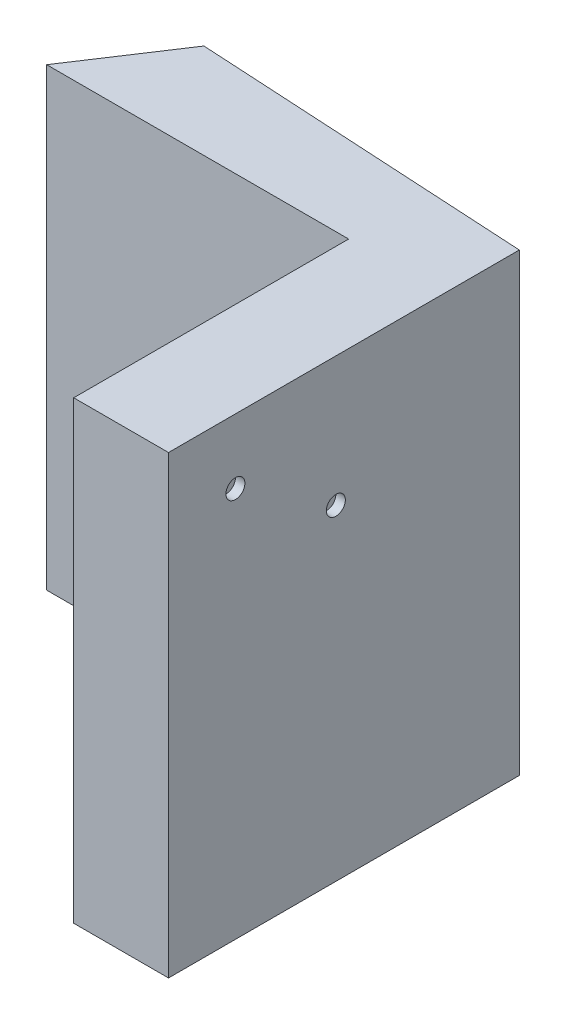
ISO-10303-21;
HEADER;
FILE_DESCRIPTION(('STEP AP214'),'2;1');
FILE_NAME('part.step','',(''),(''),'','','');
FILE_SCHEMA(('AUTOMOTIVE_DESIGN { 1 0 10303 214 1 1 1 1 }'));
ENDSEC;
DATA;
#1=APPLICATION_CONTEXT('core data for automotive mechanical design processes');
#2=APPLICATION_PROTOCOL_DEFINITION('international standard','automotive_design',2000,#1);
#3=PRODUCT_CONTEXT('',#1,'mechanical');
#4=PRODUCT('Part','Part','',(#3));
#5=PRODUCT_RELATED_PRODUCT_CATEGORY('part','',(#4));
#6=PRODUCT_DEFINITION_FORMATION('','',#4);
#7=PRODUCT_DEFINITION_CONTEXT('part definition',#1,'design');
#8=PRODUCT_DEFINITION('design','',#6,#7);
#9=PRODUCT_DEFINITION_SHAPE('','',#8);
#10=(LENGTH_UNIT() NAMED_UNIT(*) SI_UNIT(.MILLI.,.METRE.));
#11=(NAMED_UNIT(*) PLANE_ANGLE_UNIT() SI_UNIT($,.RADIAN.));
#12=(NAMED_UNIT(*) SI_UNIT($,.STERADIAN.) SOLID_ANGLE_UNIT());
#13=UNCERTAINTY_MEASURE_WITH_UNIT(LENGTH_MEASURE(1.E-05),#10,'distance_accuracy_value','');
#14=(GEOMETRIC_REPRESENTATION_CONTEXT(3) GLOBAL_UNCERTAINTY_ASSIGNED_CONTEXT((#13)) GLOBAL_UNIT_ASSIGNED_CONTEXT((#10,
#11,#12)) REPRESENTATION_CONTEXT('',''));
#15=CARTESIAN_POINT('',(0.,0.,0.));
#16=DIRECTION('',(0.,0.,1.));
#17=DIRECTION('',(1.,0.,0.));
#18=AXIS2_PLACEMENT_3D('',#15,#16,#17);
#19=CARTESIAN_POINT('',(0.,48.,0.));
#20=DIRECTION('',(0.,0.,1.));
#21=DIRECTION('',(1.,0.,0.));
#22=AXIS2_PLACEMENT_3D('',#19,#20,#21);
#23=PLANE('',#22);
#24=DIRECTION('',(-1.,0.,0.));
#25=VECTOR('',#24,1.);
#26=CARTESIAN_POINT('',(0.,17.96,0.));
#27=LINE('',#26,#25);
#28=CARTESIAN_POINT('',(0.,17.96,0.));
#29=VERTEX_POINT('',#28);
#30=CARTESIAN_POINT('',(-31.85,17.96,0.));
#31=VERTEX_POINT('',#30);
#32=EDGE_CURVE('E93',#29,#31,#27,.T.);
#33=ORIENTED_EDGE('',*,*,#32,.F.);
#34=DIRECTION('',(0.,-1.,0.));
#35=VECTOR('',#34,1.);
#36=CARTESIAN_POINT('',(0.,48.,0.));
#37=LINE('',#36,#35);
#38=CARTESIAN_POINT('',(0.,65.96,0.));
#39=VERTEX_POINT('',#38);
#40=EDGE_CURVE('E167',#39,#29,#37,.T.);
#41=ORIENTED_EDGE('',*,*,#40,.F.);
#42=DIRECTION('',(1.,0.,0.));
#43=VECTOR('',#42,1.);
#44=CARTESIAN_POINT('',(0.,65.96,0.));
#45=LINE('',#44,#43);
#46=CARTESIAN_POINT('',(-31.85,65.96,0.));
#47=VERTEX_POINT('',#46);
#48=EDGE_CURVE('E121',#47,#39,#45,.T.);
#49=ORIENTED_EDGE('',*,*,#48,.F.);
#50=DIRECTION('',(0.,-1.,0.));
#51=VECTOR('',#50,1.);
#52=CARTESIAN_POINT('',(-31.85,48.,0.));
#53=LINE('',#52,#51);
#54=EDGE_CURVE('E40',#47,#31,#53,.T.);
#55=ORIENTED_EDGE('',*,*,#54,.T.);
#56=EDGE_LOOP('',(#33,#41,#49,#55));
#57=FACE_BOUND('',#56,.T.);
#58=CARTESIAN_POINT('',(-5.62968108342815,24.9790510727815,0.));
#59=DIRECTION('',(0.,0.,1.));
#60=DIRECTION('',(1.,0.,0.));
#61=AXIS2_PLACEMENT_3D('',#58,#59,#60);
#62=CIRCLE('',#61,2.);
#63=CARTESIAN_POINT('',(-3.62968108342815,24.9790510727815,0.));
#64=VERTEX_POINT('',#63);
#65=EDGE_CURVE('E153',#64,#64,#62,.T.);
#66=ORIENTED_EDGE('',*,*,#65,.F.);
#67=EDGE_LOOP('',(#66));
#68=FACE_BOUND('',#67,.T.);
#69=CARTESIAN_POINT('',(-21.5913355474178,41.0209489272188,0.));
#70=DIRECTION('',(0.,0.,1.));
#71=DIRECTION('',(1.,0.,0.));
#72=AXIS2_PLACEMENT_3D('',#69,#70,#71);
#73=CIRCLE('',#72,2.);
#74=CARTESIAN_POINT('',(-19.5913355474178,41.0209489272188,0.));
#75=VERTEX_POINT('',#74);
#76=EDGE_CURVE('E150',#75,#75,#73,.T.);
#77=ORIENTED_EDGE('',*,*,#76,.F.);
#78=EDGE_LOOP('',(#77));
#79=FACE_BOUND('',#78,.T.);
#80=CARTESIAN_POINT('',(-21.6314572426416,25.0191727680053,0.));
#81=DIRECTION('',(0.,0.,1.));
#82=DIRECTION('',(1.,0.,0.));
#83=AXIS2_PLACEMENT_3D('',#80,#81,#82);
#84=CIRCLE('',#83,2.);
#85=CARTESIAN_POINT('',(-19.6314572426416,25.0191727680053,0.));
#86=VERTEX_POINT('',#85);
#87=EDGE_CURVE('E147',#86,#86,#84,.T.);
#88=ORIENTED_EDGE('',*,*,#87,.F.);
#89=EDGE_LOOP('',(#88));
#90=FACE_BOUND('',#89,.T.);
#91=CARTESIAN_POINT('',(-13.6296810834282,32.9790510727815,0.));
#92=DIRECTION('',(0.,0.,1.));
#93=DIRECTION('',(1.,0.,0.));
#94=AXIS2_PLACEMENT_3D('',#91,#92,#93);
#95=CIRCLE('',#94,4.2);
#96=CARTESIAN_POINT('',(-9.42968108342816,32.9790510727815,0.));
#97=VERTEX_POINT('',#96);
#98=EDGE_CURVE('E146',#97,#97,#95,.T.);
#99=ORIENTED_EDGE('',*,*,#98,.F.);
#100=EDGE_LOOP('',(#99));
#101=FACE_BOUND('',#100,.T.);
#102=CARTESIAN_POINT('',(-5.58955938820431,40.9808272319949,0.));
#103=DIRECTION('',(0.,0.,1.));
#104=DIRECTION('',(1.,0.,0.));
#105=AXIS2_PLACEMENT_3D('',#102,#103,#104);
#106=CIRCLE('',#105,2.00000000000001);
#107=CARTESIAN_POINT('',(-3.5895593882043,40.9808272319949,0.));
#108=VERTEX_POINT('',#107);
#109=EDGE_CURVE('E156',#108,#108,#106,.T.);
#110=ORIENTED_EDGE('',*,*,#109,.F.);
#111=EDGE_LOOP('',(#110));
#112=FACE_BOUND('',#111,.T.);
#113=ADVANCED_FACE('F33',(#57,#68,#79,#90,#101,#112),#23,.T.);
#114=CARTESIAN_POINT('',(0.,48.,0.));
#115=DIRECTION('',(1.,0.,0.));
#116=DIRECTION('',(0.,0.,-1.));
#117=AXIS2_PLACEMENT_3D('',#114,#115,#116);
#118=PLANE('',#117);
#119=ORIENTED_EDGE('',*,*,#40,.T.);
#120=DIRECTION('',(0.,0.,1.));
#121=VECTOR('',#120,1.);
#122=CARTESIAN_POINT('',(0.,17.96,0.));
#123=LINE('',#122,#121);
#124=CARTESIAN_POINT('',(0.,17.96,29.));
#125=VERTEX_POINT('',#124);
#126=EDGE_CURVE('E52',#29,#125,#123,.T.);
#127=ORIENTED_EDGE('',*,*,#126,.T.);
#128=DIRECTION('',(0.,-1.,0.));
#129=VECTOR('',#128,1.);
#130=CARTESIAN_POINT('',(0.,48.,29.));
#131=LINE('',#130,#129);
#132=CARTESIAN_POINT('',(0.,65.96,29.));
#133=VERTEX_POINT('',#132);
#134=EDGE_CURVE('E164',#133,#125,#131,.T.);
#135=ORIENTED_EDGE('',*,*,#134,.F.);
#136=DIRECTION('',(0.,0.,1.));
#137=VECTOR('',#136,1.);
#138=CARTESIAN_POINT('',(0.,65.96,29.));
#139=LINE('',#138,#137);
#140=EDGE_CURVE('E124',#39,#133,#139,.T.);
#141=ORIENTED_EDGE('',*,*,#140,.F.);
#142=EDGE_LOOP('',(#119,#127,#135,#141));
#143=FACE_BOUND('',#142,.T.);
#144=ADVANCED_FACE('F194',(#143),#118,.F.);
#145=CARTESIAN_POINT('',(0.,48.,29.));
#146=DIRECTION('',(0.,0.,-1.));
#147=DIRECTION('',(-1.,0.,0.));
#148=AXIS2_PLACEMENT_3D('',#145,#146,#147);
#149=PLANE('',#148);
#150=ORIENTED_EDGE('',*,*,#134,.T.);
#151=DIRECTION('',(1.,0.,0.));
#152=VECTOR('',#151,1.);
#153=CARTESIAN_POINT('',(0.,17.96,29.));
#154=LINE('',#153,#152);
#155=CARTESIAN_POINT('',(10.,17.96,29.));
#156=VERTEX_POINT('',#155);
#157=EDGE_CURVE('E129',#125,#156,#154,.T.);
#158=ORIENTED_EDGE('',*,*,#157,.T.);
#159=DIRECTION('',(0.,-1.,0.));
#160=VECTOR('',#159,1.);
#161=CARTESIAN_POINT('',(10.,48.,29.));
#162=LINE('',#161,#160);
#163=CARTESIAN_POINT('',(10.,65.96,29.));
#164=VERTEX_POINT('',#163);
#165=EDGE_CURVE('E162',#164,#156,#162,.T.);
#166=ORIENTED_EDGE('',*,*,#165,.F.);
#167=DIRECTION('',(1.,0.,0.));
#168=VECTOR('',#167,1.);
#169=CARTESIAN_POINT('',(10.,65.96,29.));
#170=LINE('',#169,#168);
#171=EDGE_CURVE('E110',#133,#164,#170,.T.);
#172=ORIENTED_EDGE('',*,*,#171,.F.);
#173=EDGE_LOOP('',(#150,#158,#166,#172));
#174=FACE_BOUND('',#173,.T.);
#175=ADVANCED_FACE('F200',(#174),#149,.F.);
#176=CARTESIAN_POINT('',(10.,48.,0.));
#177=DIRECTION('',(-1.,0.,0.));
#178=DIRECTION('',(0.,0.,1.));
#179=AXIS2_PLACEMENT_3D('',#176,#177,#178);
#180=PLANE('',#179);
#181=CARTESIAN_POINT('',(10.,59.1327980092586,21.9428792738086));
#182=DIRECTION('',(1.,0.,0.));
#183=DIRECTION('',(0.,0.,-1.));
#184=AXIS2_PLACEMENT_3D('',#181,#182,#183);
#185=CIRCLE('',#184,1.);
#186=CARTESIAN_POINT('',(10.,59.1327980092586,20.9428792738086));
#187=VERTEX_POINT('',#186);
#188=EDGE_CURVE('E114',#187,#187,#185,.T.);
#189=ORIENTED_EDGE('',*,*,#188,.F.);
#190=EDGE_LOOP('',(#189));
#191=FACE_BOUND('',#190,.T.);
#192=CARTESIAN_POINT('',(10.,52.3121828554309,11.3475695049487));
#193=DIRECTION('',(1.,0.,0.));
#194=DIRECTION('',(0.,0.,-1.));
#195=AXIS2_PLACEMENT_3D('',#192,#193,#194);
#196=CIRCLE('',#195,1.);
#197=CARTESIAN_POINT('',(10.,52.3121828554309,10.3475695049487));
#198=VERTEX_POINT('',#197);
#199=EDGE_CURVE('E117',#198,#198,#196,.T.);
#200=ORIENTED_EDGE('',*,*,#199,.F.);
#201=EDGE_LOOP('',(#200));
#202=FACE_BOUND('',#201,.T.);
#203=ORIENTED_EDGE('',*,*,#165,.T.);
#204=DIRECTION('',(0.,0.,-1.));
#205=VECTOR('',#204,1.);
#206=CARTESIAN_POINT('',(10.,17.96,0.));
#207=LINE('',#206,#205);
#208=CARTESIAN_POINT('',(10.,17.96,-8.));
#209=VERTEX_POINT('',#208);
#210=EDGE_CURVE('E90',#156,#209,#207,.T.);
#211=ORIENTED_EDGE('',*,*,#210,.T.);
#212=DIRECTION('',(0.,1.,0.));
#213=VECTOR('',#212,1.);
#214=CARTESIAN_POINT('',(10.,0.,-8.));
#215=LINE('',#214,#213);
#216=CARTESIAN_POINT('',(10.,65.96,-8.));
#217=VERTEX_POINT('',#216);
#218=EDGE_CURVE('E84',#209,#217,#215,.T.);
#219=ORIENTED_EDGE('',*,*,#218,.T.);
#220=DIRECTION('',(0.,0.,-1.));
#221=VECTOR('',#220,1.);
#222=CARTESIAN_POINT('',(10.,65.96,-8.));
#223=LINE('',#222,#221);
#224=EDGE_CURVE('E89',#164,#217,#223,.T.);
#225=ORIENTED_EDGE('',*,*,#224,.F.);
#226=EDGE_LOOP('',(#203,#211,#219,#225));
#227=FACE_BOUND('',#226,.T.);
#228=ADVANCED_FACE('F87',(#191,#202,#227),#180,.F.);
#229=CARTESIAN_POINT('',(-25.2631742495093,0.,-10.));
#230=DIRECTION('',(0.835114859081226,0.,0.550075605841365));
#231=DIRECTION('',(0.550075605841365,0.,-0.835114859081226));
#232=AXIS2_PLACEMENT_3D('',#229,#230,#231);
#233=PLANE('',#232);
#234=DIRECTION('',(0.,1.,0.));
#235=VECTOR('',#234,1.);
#236=CARTESIAN_POINT('',(-25.2631742495093,0.,-10.));
#237=LINE('',#236,#235);
#238=CARTESIAN_POINT('',(-25.2631742495093,17.96,-10.));
#239=VERTEX_POINT('',#238);
#240=CARTESIAN_POINT('',(-25.2631742495093,65.96,-10.));
#241=VERTEX_POINT('',#240);
#242=EDGE_CURVE('E100',#239,#241,#237,.T.);
#243=ORIENTED_EDGE('',*,*,#242,.F.);
#244=DIRECTION('',(-0.550075605841365,0.,0.835114859081226));
#245=VECTOR('',#244,1.);
#246=CARTESIAN_POINT('',(-25.2631742495093,17.96,-10.));
#247=LINE('',#246,#245);
#248=EDGE_CURVE('E47',#239,#31,#247,.T.);
#249=ORIENTED_EDGE('',*,*,#248,.T.);
#250=ORIENTED_EDGE('',*,*,#54,.F.);
#251=DIRECTION('',(-0.550075605841365,0.,0.835114859081226));
#252=VECTOR('',#251,1.);
#253=CARTESIAN_POINT('',(-31.85,65.96,0.));
#254=LINE('',#253,#252);
#255=EDGE_CURVE('E104',#241,#47,#254,.T.);
#256=ORIENTED_EDGE('',*,*,#255,.F.);
#257=EDGE_LOOP('',(#243,#249,#250,#256));
#258=FACE_BOUND('',#257,.T.);
#259=ADVANCED_FACE('F189',(#258),#233,.F.);
#260=CARTESIAN_POINT('',(-5.58955938820431,40.9808272319949,-48.));
#261=DIRECTION('',(0.,0.,1.));
#262=DIRECTION('',(1.,0.,0.));
#263=AXIS2_PLACEMENT_3D('',#260,#261,#262);
#264=CYLINDRICAL_SURFACE('',#263,2.00000000000001);
#265=CARTESIAN_POINT('',(-5.58955938820431,40.9808272319949,-8.88418355522384));
#266=DIRECTION('',(-0.0566253898941637,0.,0.998395495392149));
#267=DIRECTION('',(0.998395495392149,0.,0.0566253898941637));
#268=AXIS2_PLACEMENT_3D('',#265,#266,#267);
#269=ELLIPSE('',#268,2.00321416636045,2.00000000000001);
#270=CARTESIAN_POINT('',(-3.5895593882043,40.9808272319949,-8.77075077201216));
#271=VERTEX_POINT('',#270);
#272=EDGE_CURVE('E143',#271,#271,#269,.F.);
#273=ORIENTED_EDGE('',*,*,#272,.T.);
#274=EDGE_LOOP('',(#273));
#275=FACE_BOUND('',#274,.T.);
#276=ORIENTED_EDGE('',*,*,#109,.T.);
#277=EDGE_LOOP('',(#276));
#278=FACE_BOUND('',#277,.T.);
#279=ADVANCED_FACE('F185',(#275,#278),#264,.F.);
#280=CARTESIAN_POINT('',(-13.6296810834282,32.9790510727815,-48.));
#281=DIRECTION('',(0.,0.,1.));
#282=DIRECTION('',(1.,0.,0.));
#283=AXIS2_PLACEMENT_3D('',#280,#281,#282);
#284=CYLINDRICAL_SURFACE('',#283,4.2);
#285=CARTESIAN_POINT('',(-13.6296810834282,32.9790510727815,-9.34019024584873));
#286=DIRECTION('',(-0.0566253898941637,0.,0.998395495392149));
#287=DIRECTION('',(0.998395495392149,0.,0.0566253898941637));
#288=AXIS2_PLACEMENT_3D('',#285,#286,#287);
#289=ELLIPSE('',#288,4.20674974935692,4.2);
#290=CARTESIAN_POINT('',(-9.42968108342816,32.9790510727815,-9.10198140110422));
#291=VERTEX_POINT('',#290);
#292=EDGE_CURVE('E140',#291,#291,#289,.F.);
#293=ORIENTED_EDGE('',*,*,#292,.T.);
#294=EDGE_LOOP('',(#293));
#295=FACE_BOUND('',#294,.T.);
#296=ORIENTED_EDGE('',*,*,#98,.T.);
#297=EDGE_LOOP('',(#296));
#298=FACE_BOUND('',#297,.T.);
#299=ADVANCED_FACE('F188',(#295,#298),#284,.F.);
#300=CARTESIAN_POINT('',(-21.6314572426416,25.0191727680053,-48.));
#301=DIRECTION('',(0.,0.,1.));
#302=DIRECTION('',(1.,0.,0.));
#303=AXIS2_PLACEMENT_3D('',#300,#301,#302);
#304=CYLINDRICAL_SURFACE('',#303,2.);
#305=CARTESIAN_POINT('',(-21.6314572426416,25.0191727680053,-9.79402211603692));
#306=DIRECTION('',(-0.0566253898941637,0.,0.998395495392149));
#307=DIRECTION('',(0.998395495392149,0.,0.0566253898941637));
#308=AXIS2_PLACEMENT_3D('',#305,#306,#307);
#309=ELLIPSE('',#308,2.00321416636044,2.);
#310=CARTESIAN_POINT('',(-19.6314572426416,25.0191727680053,-9.68058933282525));
#311=VERTEX_POINT('',#310);
#312=EDGE_CURVE('E137',#311,#311,#309,.F.);
#313=ORIENTED_EDGE('',*,*,#312,.T.);
#314=EDGE_LOOP('',(#313));
#315=FACE_BOUND('',#314,.T.);
#316=ORIENTED_EDGE('',*,*,#87,.T.);
#317=EDGE_LOOP('',(#316));
#318=FACE_BOUND('',#317,.T.);
#319=ADVANCED_FACE('F212',(#315,#318),#304,.F.);
#320=CARTESIAN_POINT('',(-21.5913355474178,41.0209489272188,-48.));
#321=DIRECTION('',(0.,0.,1.));
#322=DIRECTION('',(1.,0.,0.));
#323=AXIS2_PLACEMENT_3D('',#320,#321,#322);
#324=CYLINDRICAL_SURFACE('',#323,2.);
#325=CARTESIAN_POINT('',(-21.5913355474178,41.0209489272188,-9.79174655825871));
#326=DIRECTION('',(-0.0566253898941637,0.,0.998395495392149));
#327=DIRECTION('',(0.998395495392149,0.,0.0566253898941637));
#328=AXIS2_PLACEMENT_3D('',#325,#326,#327);
#329=ELLIPSE('',#328,2.00321416636044,2.);
#330=CARTESIAN_POINT('',(-19.5913355474178,41.0209489272188,-9.67831377504704));
#331=VERTEX_POINT('',#330);
#332=EDGE_CURVE('E134',#331,#331,#329,.F.);
#333=ORIENTED_EDGE('',*,*,#332,.T.);
#334=EDGE_LOOP('',(#333));
#335=FACE_BOUND('',#334,.T.);
#336=ORIENTED_EDGE('',*,*,#76,.T.);
#337=EDGE_LOOP('',(#336));
#338=FACE_BOUND('',#337,.T.);
#339=ADVANCED_FACE('F218',(#335,#338),#324,.F.);
#340=CARTESIAN_POINT('',(-5.62968108342815,24.9790510727815,-48.));
#341=DIRECTION('',(0.,0.,1.));
#342=DIRECTION('',(1.,0.,0.));
#343=AXIS2_PLACEMENT_3D('',#340,#341,#342);
#344=CYLINDRICAL_SURFACE('',#343,2.);
#345=CARTESIAN_POINT('',(-5.62968108342815,24.9790510727815,-8.88645911300204));
#346=DIRECTION('',(-0.0566253898941637,0.,0.998395495392149));
#347=DIRECTION('',(0.998395495392149,0.,0.0566253898941637));
#348=AXIS2_PLACEMENT_3D('',#345,#346,#347);
#349=ELLIPSE('',#348,2.00321416636044,2.);
#350=CARTESIAN_POINT('',(-3.62968108342815,24.9790510727815,-8.77302632979037));
#351=VERTEX_POINT('',#350);
#352=EDGE_CURVE('E92',#351,#351,#349,.F.);
#353=ORIENTED_EDGE('',*,*,#352,.T.);
#354=EDGE_LOOP('',(#353));
#355=FACE_BOUND('',#354,.T.);
#356=ORIENTED_EDGE('',*,*,#65,.T.);
#357=EDGE_LOOP('',(#356));
#358=FACE_BOUND('',#357,.T.);
#359=ADVANCED_FACE('F174',(#355,#358),#344,.F.);
#360=CARTESIAN_POINT('',(-25.2631742495093,0.,-10.));
#361=DIRECTION('',(-0.0566253898941637,0.,0.998395495392149));
#362=DIRECTION('',(0.998395495392149,0.,0.0566253898941637));
#363=AXIS2_PLACEMENT_3D('',#360,#361,#362);
#364=PLANE('',#363);
#365=CARTESIAN_POINT('',(-1.24633578852833,58.3499027037817,-8.63785158471291));
#366=DIRECTION('',(0.0566253898941637,0.,-0.998395495392149));
#367=DIRECTION('',(-0.998395495392149,0.,-0.0566253898941637));
#368=AXIS2_PLACEMENT_3D('',#365,#366,#367);
#369=CIRCLE('',#368,1.);
#370=CARTESIAN_POINT('',(-2.24473128392048,58.3499027037817,-8.69447697460707));
#371=VERTEX_POINT('',#370);
#372=EDGE_CURVE('E274',#371,#371,#369,.T.);
#373=ORIENTED_EDGE('',*,*,#372,.F.);
#374=EDGE_LOOP('',(#373));
#375=FACE_BOUND('',#374,.T.);
#376=ORIENTED_EDGE('',*,*,#292,.F.);
#377=EDGE_LOOP('',(#376));
#378=FACE_BOUND('',#377,.T.);
#379=ORIENTED_EDGE('',*,*,#332,.F.);
#380=EDGE_LOOP('',(#379));
#381=FACE_BOUND('',#380,.T.);
#382=ORIENTED_EDGE('',*,*,#218,.F.);
#383=DIRECTION('',(-0.998395495392149,0.,-0.0566253898941637));
#384=VECTOR('',#383,1.);
#385=CARTESIAN_POINT('',(-25.2631742495093,17.96,-10.));
#386=LINE('',#385,#384);
#387=EDGE_CURVE('E11',#209,#239,#386,.T.);
#388=ORIENTED_EDGE('',*,*,#387,.T.);
#389=ORIENTED_EDGE('',*,*,#242,.T.);
#390=DIRECTION('',(-0.998395495392149,0.,-0.0566253898941637));
#391=VECTOR('',#390,1.);
#392=CARTESIAN_POINT('',(-25.2631742495093,65.96,-10.));
#393=LINE('',#392,#391);
#394=EDGE_CURVE('E96',#217,#241,#393,.T.);
#395=ORIENTED_EDGE('',*,*,#394,.F.);
#396=EDGE_LOOP('',(#382,#388,#389,#395));
#397=FACE_BOUND('',#396,.T.);
#398=ORIENTED_EDGE('',*,*,#352,.F.);
#399=EDGE_LOOP('',(#398));
#400=FACE_BOUND('',#399,.T.);
#401=ORIENTED_EDGE('',*,*,#312,.F.);
#402=EDGE_LOOP('',(#401));
#403=FACE_BOUND('',#402,.T.);
#404=ORIENTED_EDGE('',*,*,#272,.F.);
#405=EDGE_LOOP('',(#404));
#406=FACE_BOUND('',#405,.T.);
#407=ADVANCED_FACE('F97',(#375,#378,#381,#397,#400,#403,#406),#364,.F.);
#408=CARTESIAN_POINT('',(0.,17.96,0.));
#409=DIRECTION('',(0.,1.,0.));
#410=DIRECTION('',(0.,0.,1.));
#411=AXIS2_PLACEMENT_3D('',#408,#409,#410);
#412=PLANE('',#411);
#413=ORIENTED_EDGE('',*,*,#32,.T.);
#414=ORIENTED_EDGE('',*,*,#248,.F.);
#415=ORIENTED_EDGE('',*,*,#387,.F.);
#416=ORIENTED_EDGE('',*,*,#210,.F.);
#417=ORIENTED_EDGE('',*,*,#157,.F.);
#418=ORIENTED_EDGE('',*,*,#126,.F.);
#419=EDGE_LOOP('',(#413,#414,#415,#416,#417,#418));
#420=FACE_BOUND('',#419,.T.);
#421=ADVANCED_FACE('F178',(#420),#412,.F.);
#422=CARTESIAN_POINT('',(0.,65.96,0.));
#423=DIRECTION('',(0.,-1.,0.));
#424=DIRECTION('',(0.,0.,-1.));
#425=AXIS2_PLACEMENT_3D('',#422,#423,#424);
#426=PLANE('',#425);
#427=ORIENTED_EDGE('',*,*,#224,.T.);
#428=ORIENTED_EDGE('',*,*,#394,.T.);
#429=ORIENTED_EDGE('',*,*,#255,.T.);
#430=ORIENTED_EDGE('',*,*,#48,.T.);
#431=ORIENTED_EDGE('',*,*,#140,.T.);
#432=ORIENTED_EDGE('',*,*,#171,.T.);
#433=EDGE_LOOP('',(#427,#428,#429,#430,#431,#432));
#434=FACE_BOUND('',#433,.T.);
#435=ADVANCED_FACE('F107',(#434),#426,.F.);
#436=CARTESIAN_POINT('',(9.,52.3121828554309,11.3475695049487));
#437=DIRECTION('',(1.,0.,0.));
#438=DIRECTION('',(0.,0.,-1.));
#439=AXIS2_PLACEMENT_3D('',#436,#437,#438);
#440=CYLINDRICAL_SURFACE('',#439,1.);
#441=CARTESIAN_POINT('',(9.,52.3121828554309,11.3475695049487));
#442=DIRECTION('',(1.,0.,0.));
#443=DIRECTION('',(0.,0.,-1.));
#444=AXIS2_PLACEMENT_3D('',#441,#442,#443);
#445=CIRCLE('',#444,1.);
#446=CARTESIAN_POINT('',(9.,52.3121828554309,10.3475695049487));
#447=VERTEX_POINT('',#446);
#448=EDGE_CURVE('E277',#447,#447,#445,.T.);
#449=ORIENTED_EDGE('',*,*,#448,.F.);
#450=EDGE_LOOP('',(#449));
#451=FACE_BOUND('',#450,.T.);
#452=ORIENTED_EDGE('',*,*,#199,.T.);
#453=EDGE_LOOP('',(#452));
#454=FACE_BOUND('',#453,.T.);
#455=ADVANCED_FACE('F244',(#451,#454),#440,.F.);
#456=CARTESIAN_POINT('',(9.,52.3121828554309,11.3475695049487));
#457=DIRECTION('',(1.,0.,0.));
#458=DIRECTION('',(0.,0.,-1.));
#459=AXIS2_PLACEMENT_3D('',#456,#457,#458);
#460=PLANE('',#459);
#461=ORIENTED_EDGE('',*,*,#448,.T.);
#462=EDGE_LOOP('',(#461));
#463=FACE_BOUND('',#462,.T.);
#464=ADVANCED_FACE('F249',(#463),#460,.T.);
#465=CARTESIAN_POINT('',(9.00000000000001,59.1327980092586,21.9428792738086));
#466=DIRECTION('',(1.,0.,0.));
#467=DIRECTION('',(0.,0.,-1.));
#468=AXIS2_PLACEMENT_3D('',#465,#466,#467);
#469=CYLINDRICAL_SURFACE('',#468,1.);
#470=CARTESIAN_POINT('',(9.00000000000001,59.1327980092586,21.9428792738086));
#471=DIRECTION('',(1.,0.,0.));
#472=DIRECTION('',(0.,0.,-1.));
#473=AXIS2_PLACEMENT_3D('',#470,#471,#472);
#474=CIRCLE('',#473,1.);
#475=CARTESIAN_POINT('',(9.00000000000001,59.1327980092586,20.9428792738086));
#476=VERTEX_POINT('',#475);
#477=EDGE_CURVE('E111',#476,#476,#474,.T.);
#478=ORIENTED_EDGE('',*,*,#477,.F.);
#479=EDGE_LOOP('',(#478));
#480=FACE_BOUND('',#479,.T.);
#481=ORIENTED_EDGE('',*,*,#188,.T.);
#482=EDGE_LOOP('',(#481));
#483=FACE_BOUND('',#482,.T.);
#484=ADVANCED_FACE('F253',(#480,#483),#469,.F.);
#485=CARTESIAN_POINT('',(9.00000000000001,59.1327980092586,21.9428792738086));
#486=DIRECTION('',(1.,0.,0.));
#487=DIRECTION('',(0.,0.,-1.));
#488=AXIS2_PLACEMENT_3D('',#485,#486,#487);
#489=PLANE('',#488);
#490=ORIENTED_EDGE('',*,*,#477,.T.);
#491=EDGE_LOOP('',(#490));
#492=FACE_BOUND('',#491,.T.);
#493=ADVANCED_FACE('F257',(#492),#489,.T.);
#494=CARTESIAN_POINT('',(-1.30296117842249,58.3499027037817,-7.63945608932076));
#495=DIRECTION('',(0.0566253898941637,0.,-0.998395495392149));
#496=DIRECTION('',(-0.998395495392149,0.,-0.0566253898941637));
#497=AXIS2_PLACEMENT_3D('',#494,#495,#496);
#498=CYLINDRICAL_SURFACE('',#497,1.);
#499=CARTESIAN_POINT('',(-1.30296117842249,58.3499027037817,-7.63945608932076));
#500=DIRECTION('',(0.0566253898941637,0.,-0.998395495392149));
#501=DIRECTION('',(-0.998395495392149,0.,-0.0566253898941637));
#502=AXIS2_PLACEMENT_3D('',#499,#500,#501);
#503=CIRCLE('',#502,1.);
#504=CARTESIAN_POINT('',(-2.30135667381464,58.3499027037817,-7.69608147921492));
#505=VERTEX_POINT('',#504);
#506=EDGE_CURVE('E273',#505,#505,#503,.T.);
#507=ORIENTED_EDGE('',*,*,#506,.F.);
#508=EDGE_LOOP('',(#507));
#509=FACE_BOUND('',#508,.T.);
#510=ORIENTED_EDGE('',*,*,#372,.T.);
#511=EDGE_LOOP('',(#510));
#512=FACE_BOUND('',#511,.T.);
#513=ADVANCED_FACE('F261',(#509,#512),#498,.F.);
#514=CARTESIAN_POINT('',(-1.30296117842249,58.3499027037817,-7.63945608932076));
#515=DIRECTION('',(0.0566253898941637,0.,-0.998395495392149));
#516=DIRECTION('',(-0.998395495392149,0.,-0.0566253898941637));
#517=AXIS2_PLACEMENT_3D('',#514,#515,#516);
#518=PLANE('',#517);
#519=ORIENTED_EDGE('',*,*,#506,.T.);
#520=EDGE_LOOP('',(#519));
#521=FACE_BOUND('',#520,.T.);
#522=ADVANCED_FACE('F265',(#521),#518,.T.);
#523=CLOSED_SHELL('',(#113,#144,#175,#228,#259,#279,#299,#319,#339,#359,#407,#421,#435,#455,
#464,#484,#493,#513,#522));
#524=MANIFOLD_SOLID_BREP('B2',#523);
#525=ADVANCED_BREP_SHAPE_REPRESENTATION('',(#18,#524),#14);
#526=SHAPE_DEFINITION_REPRESENTATION(#9,#525);
ENDSEC;
END-ISO-10303-21;
